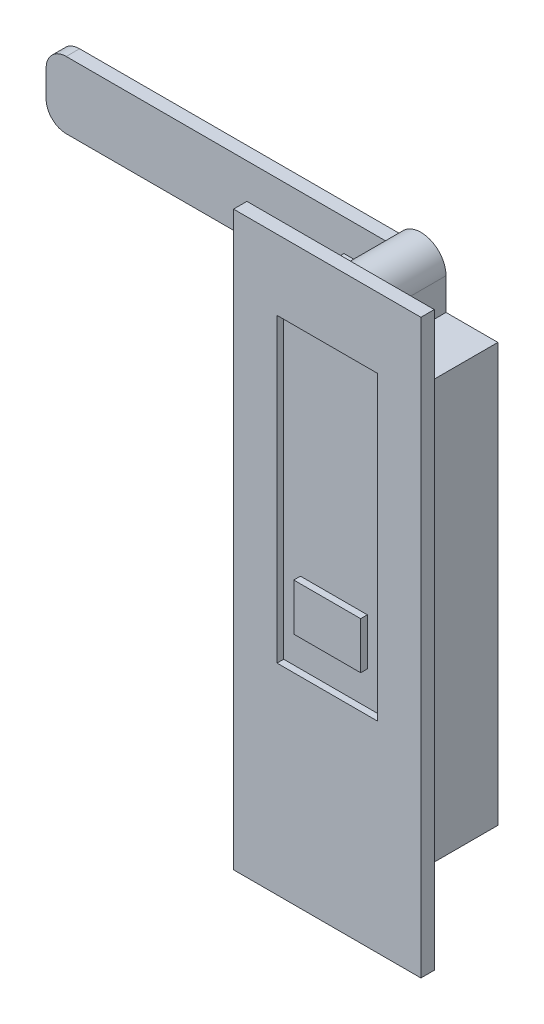
ISO-10303-21;
HEADER;
FILE_DESCRIPTION(('STEP AP214'),'2;1');
FILE_NAME('part.step','',(''),(''),'','','');
FILE_SCHEMA(('AUTOMOTIVE_DESIGN { 1 0 10303 214 1 1 1 1 }'));
ENDSEC;
DATA;
#1=APPLICATION_CONTEXT('core data for automotive mechanical design processes');
#2=APPLICATION_PROTOCOL_DEFINITION('international standard','automotive_design',2000,#1);
#3=PRODUCT_CONTEXT('',#1,'mechanical');
#4=PRODUCT('Part','Part','',(#3));
#5=PRODUCT_RELATED_PRODUCT_CATEGORY('part','',(#4));
#6=PRODUCT_DEFINITION_FORMATION('','',#4);
#7=PRODUCT_DEFINITION_CONTEXT('part definition',#1,'design');
#8=PRODUCT_DEFINITION('design','',#6,#7);
#9=PRODUCT_DEFINITION_SHAPE('','',#8);
#10=(LENGTH_UNIT() NAMED_UNIT(*) SI_UNIT(.MILLI.,.METRE.));
#11=(NAMED_UNIT(*) PLANE_ANGLE_UNIT() SI_UNIT($,.RADIAN.));
#12=(NAMED_UNIT(*) SI_UNIT($,.STERADIAN.) SOLID_ANGLE_UNIT());
#13=UNCERTAINTY_MEASURE_WITH_UNIT(LENGTH_MEASURE(1.E-05),#10,'distance_accuracy_value','');
#14=(GEOMETRIC_REPRESENTATION_CONTEXT(3) GLOBAL_UNCERTAINTY_ASSIGNED_CONTEXT((#13)) GLOBAL_UNIT_ASSIGNED_CONTEXT((#10,
#11,#12)) REPRESENTATION_CONTEXT('',''));
#15=CARTESIAN_POINT('',(0.,0.,0.));
#16=DIRECTION('',(0.,0.,1.));
#17=DIRECTION('',(1.,0.,0.));
#18=AXIS2_PLACEMENT_3D('',#15,#16,#17);
#19=CARTESIAN_POINT('',(14.,-42.75,2.));
#20=DIRECTION('',(-1.,0.,0.));
#21=DIRECTION('',(0.,0.,1.));
#22=AXIS2_PLACEMENT_3D('',#19,#20,#21);
#23=PLANE('',#22);
#24=DIRECTION('',(0.,1.,0.));
#25=VECTOR('',#24,1.);
#26=CARTESIAN_POINT('',(14.,-42.75,0.));
#27=LINE('',#26,#25);
#28=CARTESIAN_POINT('',(14.,-42.75,0.));
#29=VERTEX_POINT('',#28);
#30=CARTESIAN_POINT('',(14.,42.75,0.));
#31=VERTEX_POINT('',#30);
#32=EDGE_CURVE('E479',#29,#31,#27,.T.);
#33=ORIENTED_EDGE('',*,*,#32,.T.);
#34=DIRECTION('',(0.,0.,-1.));
#35=VECTOR('',#34,1.);
#36=CARTESIAN_POINT('',(14.,42.75,2.));
#37=LINE('',#36,#35);
#38=CARTESIAN_POINT('',(14.,42.75,2.));
#39=VERTEX_POINT('',#38);
#40=EDGE_CURVE('E46',#39,#31,#37,.T.);
#41=ORIENTED_EDGE('',*,*,#40,.F.);
#42=DIRECTION('',(0.,1.,0.));
#43=VECTOR('',#42,1.);
#44=CARTESIAN_POINT('',(14.,-42.75,2.));
#45=LINE('',#44,#43);
#46=CARTESIAN_POINT('',(14.,-42.75,2.));
#47=VERTEX_POINT('',#46);
#48=EDGE_CURVE('E489',#47,#39,#45,.T.);
#49=ORIENTED_EDGE('',*,*,#48,.F.);
#50=DIRECTION('',(0.,0.,-1.));
#51=VECTOR('',#50,1.);
#52=CARTESIAN_POINT('',(14.,-42.75,2.));
#53=LINE('',#52,#51);
#54=EDGE_CURVE('E503',#47,#29,#53,.T.);
#55=ORIENTED_EDGE('',*,*,#54,.T.);
#56=EDGE_LOOP('',(#33,#41,#49,#55));
#57=FACE_BOUND('',#56,.T.);
#58=ADVANCED_FACE('F43',(#57),#23,.F.);
#59=CARTESIAN_POINT('',(-14.,42.75,2.));
#60=DIRECTION('',(0.,-1.,0.));
#61=DIRECTION('',(0.,0.,-1.));
#62=AXIS2_PLACEMENT_3D('',#59,#60,#61);
#63=PLANE('',#62);
#64=DIRECTION('',(-1.,0.,0.));
#65=VECTOR('',#64,1.);
#66=CARTESIAN_POINT('',(-14.,42.75,0.));
#67=LINE('',#66,#65);
#68=CARTESIAN_POINT('',(-14.,42.75,0.));
#69=VERTEX_POINT('',#68);
#70=EDGE_CURVE('E507',#31,#69,#67,.T.);
#71=ORIENTED_EDGE('',*,*,#70,.T.);
#72=DIRECTION('',(0.,0.,-1.));
#73=VECTOR('',#72,1.);
#74=CARTESIAN_POINT('',(-14.,42.75,2.));
#75=LINE('',#74,#73);
#76=CARTESIAN_POINT('',(-14.,42.75,2.));
#77=VERTEX_POINT('',#76);
#78=EDGE_CURVE('E521',#77,#69,#75,.T.);
#79=ORIENTED_EDGE('',*,*,#78,.F.);
#80=DIRECTION('',(-1.,0.,0.));
#81=VECTOR('',#80,1.);
#82=CARTESIAN_POINT('',(-14.,42.75,2.));
#83=LINE('',#82,#81);
#84=EDGE_CURVE('E493',#39,#77,#83,.T.);
#85=ORIENTED_EDGE('',*,*,#84,.F.);
#86=ORIENTED_EDGE('',*,*,#40,.T.);
#87=EDGE_LOOP('',(#71,#79,#85,#86));
#88=FACE_BOUND('',#87,.T.);
#89=ADVANCED_FACE('F532',(#88),#63,.F.);
#90=CARTESIAN_POINT('',(-14.,-42.75,2.));
#91=DIRECTION('',(1.,0.,0.));
#92=DIRECTION('',(0.,0.,-1.));
#93=AXIS2_PLACEMENT_3D('',#90,#91,#92);
#94=PLANE('',#93);
#95=DIRECTION('',(0.,-1.,0.));
#96=VECTOR('',#95,1.);
#97=CARTESIAN_POINT('',(-14.,-42.75,0.));
#98=LINE('',#97,#96);
#99=CARTESIAN_POINT('',(-14.,-42.75,0.));
#100=VERTEX_POINT('',#99);
#101=EDGE_CURVE('E510',#69,#100,#98,.T.);
#102=ORIENTED_EDGE('',*,*,#101,.T.);
#103=DIRECTION('',(0.,0.,-1.));
#104=VECTOR('',#103,1.);
#105=CARTESIAN_POINT('',(-14.,-42.75,2.));
#106=LINE('',#105,#104);
#107=CARTESIAN_POINT('',(-14.,-42.75,2.));
#108=VERTEX_POINT('',#107);
#109=EDGE_CURVE('E518',#108,#100,#106,.T.);
#110=ORIENTED_EDGE('',*,*,#109,.F.);
#111=DIRECTION('',(0.,-1.,0.));
#112=VECTOR('',#111,1.);
#113=CARTESIAN_POINT('',(-14.,-42.75,2.));
#114=LINE('',#113,#112);
#115=EDGE_CURVE('E497',#77,#108,#114,.T.);
#116=ORIENTED_EDGE('',*,*,#115,.F.);
#117=ORIENTED_EDGE('',*,*,#78,.T.);
#118=EDGE_LOOP('',(#102,#110,#116,#117));
#119=FACE_BOUND('',#118,.T.);
#120=ADVANCED_FACE('F541',(#119),#94,.F.);
#121=CARTESIAN_POINT('',(-14.,-42.75,2.));
#122=DIRECTION('',(0.,1.,0.));
#123=DIRECTION('',(0.,0.,1.));
#124=AXIS2_PLACEMENT_3D('',#121,#122,#123);
#125=PLANE('',#124);
#126=DIRECTION('',(1.,0.,0.));
#127=VECTOR('',#126,1.);
#128=CARTESIAN_POINT('',(-14.,-42.75,0.));
#129=LINE('',#128,#127);
#130=EDGE_CURVE('E494',#100,#29,#129,.T.);
#131=ORIENTED_EDGE('',*,*,#130,.T.);
#132=ORIENTED_EDGE('',*,*,#54,.F.);
#133=DIRECTION('',(1.,0.,0.));
#134=VECTOR('',#133,1.);
#135=CARTESIAN_POINT('',(-14.,-42.75,2.));
#136=LINE('',#135,#134);
#137=EDGE_CURVE('E500',#108,#47,#136,.T.);
#138=ORIENTED_EDGE('',*,*,#137,.F.);
#139=ORIENTED_EDGE('',*,*,#109,.T.);
#140=EDGE_LOOP('',(#131,#132,#138,#139));
#141=FACE_BOUND('',#140,.T.);
#142=ADVANCED_FACE('F544',(#141),#125,.F.);
#143=CARTESIAN_POINT('',(0.,0.,2.));
#144=DIRECTION('',(0.,0.,-1.));
#145=DIRECTION('',(-1.,0.,0.));
#146=AXIS2_PLACEMENT_3D('',#143,#144,#145);
#147=PLANE('',#146);
#148=DIRECTION('',(-1.,0.,0.));
#149=VECTOR('',#148,1.);
#150=CARTESIAN_POINT('',(-7.5,32.25,2.));
#151=LINE('',#150,#149);
#152=CARTESIAN_POINT('',(7.5,32.25,2.));
#153=VERTEX_POINT('',#152);
#154=CARTESIAN_POINT('',(-7.5,32.25,2.));
#155=VERTEX_POINT('',#154);
#156=EDGE_CURVE('E465',#153,#155,#151,.T.);
#157=ORIENTED_EDGE('',*,*,#156,.F.);
#158=DIRECTION('',(0.,1.,0.));
#159=VECTOR('',#158,1.);
#160=CARTESIAN_POINT('',(7.5,-12.75,2.));
#161=LINE('',#160,#159);
#162=CARTESIAN_POINT('',(7.5,-12.75,2.));
#163=VERTEX_POINT('',#162);
#164=EDGE_CURVE('E435',#163,#153,#161,.T.);
#165=ORIENTED_EDGE('',*,*,#164,.F.);
#166=DIRECTION('',(1.,0.,0.));
#167=VECTOR('',#166,1.);
#168=CARTESIAN_POINT('',(-7.5,-12.75,2.));
#169=LINE('',#168,#167);
#170=CARTESIAN_POINT('',(-7.5,-12.75,2.));
#171=VERTEX_POINT('',#170);
#172=EDGE_CURVE('E450',#171,#163,#169,.T.);
#173=ORIENTED_EDGE('',*,*,#172,.F.);
#174=DIRECTION('',(0.,-1.,0.));
#175=VECTOR('',#174,1.);
#176=CARTESIAN_POINT('',(-7.5,-12.75,2.));
#177=LINE('',#176,#175);
#178=EDGE_CURVE('E469',#155,#171,#177,.T.);
#179=ORIENTED_EDGE('',*,*,#178,.F.);
#180=EDGE_LOOP('',(#157,#165,#173,#179));
#181=FACE_BOUND('',#180,.T.);
#182=ORIENTED_EDGE('',*,*,#48,.T.);
#183=ORIENTED_EDGE('',*,*,#84,.T.);
#184=ORIENTED_EDGE('',*,*,#115,.T.);
#185=ORIENTED_EDGE('',*,*,#137,.T.);
#186=EDGE_LOOP('',(#182,#183,#184,#185));
#187=FACE_BOUND('',#186,.T.);
#188=ADVANCED_FACE('F546',(#181,#187),#147,.F.);
#189=CARTESIAN_POINT('',(0.,0.,0.));
#190=DIRECTION('',(0.,0.,-1.));
#191=DIRECTION('',(-1.,0.,0.));
#192=AXIS2_PLACEMENT_3D('',#189,#190,#191);
#193=PLANE('',#192);
#194=DIRECTION('',(-1.,0.,0.));
#195=VECTOR('',#194,1.);
#196=CARTESIAN_POINT('',(0.,-31.25,0.));
#197=LINE('',#196,#195);
#198=CARTESIAN_POINT('',(11.5,-31.25,0.));
#199=VERTEX_POINT('',#198);
#200=CARTESIAN_POINT('',(3.75,-31.25,0.));
#201=VERTEX_POINT('',#200);
#202=EDGE_CURVE('E266',#199,#201,#197,.T.);
#203=ORIENTED_EDGE('',*,*,#202,.F.);
#204=DIRECTION('',(0.,1.,0.));
#205=VECTOR('',#204,1.);
#206=CARTESIAN_POINT('',(11.5,0.,0.));
#207=LINE('',#206,#205);
#208=CARTESIAN_POINT('',(11.5,31.25,0.));
#209=VERTEX_POINT('',#208);
#210=EDGE_CURVE('E280',#199,#209,#207,.T.);
#211=ORIENTED_EDGE('',*,*,#210,.T.);
#212=DIRECTION('',(-1.,0.,0.));
#213=VECTOR('',#212,1.);
#214=CARTESIAN_POINT('',(0.,31.25,0.));
#215=LINE('',#214,#213);
#216=CARTESIAN_POINT('',(3.75,31.25,0.));
#217=VERTEX_POINT('',#216);
#218=EDGE_CURVE('E352',#209,#217,#215,.T.);
#219=ORIENTED_EDGE('',*,*,#218,.T.);
#220=DIRECTION('',(0.,1.,0.));
#221=VECTOR('',#220,1.);
#222=CARTESIAN_POINT('',(3.75,0.,0.));
#223=LINE('',#222,#221);
#224=CARTESIAN_POINT('',(3.75,36.,0.));
#225=VERTEX_POINT('',#224);
#226=EDGE_CURVE('E348',#217,#225,#223,.T.);
#227=ORIENTED_EDGE('',*,*,#226,.T.);
#228=CARTESIAN_POINT('',(0.,36.,0.));
#229=DIRECTION('',(0.,0.,-1.));
#230=DIRECTION('',(-1.,0.,0.));
#231=AXIS2_PLACEMENT_3D('',#228,#229,#230);
#232=CIRCLE('',#231,3.75);
#233=CARTESIAN_POINT('',(-3.75,36.,0.));
#234=VERTEX_POINT('',#233);
#235=EDGE_CURVE('E344',#234,#225,#232,.T.);
#236=ORIENTED_EDGE('',*,*,#235,.F.);
#237=DIRECTION('',(0.,1.,0.));
#238=VECTOR('',#237,1.);
#239=CARTESIAN_POINT('',(-3.75,0.,0.));
#240=LINE('',#239,#238);
#241=CARTESIAN_POINT('',(-3.75,31.25,0.));
#242=VERTEX_POINT('',#241);
#243=EDGE_CURVE('E341',#242,#234,#240,.T.);
#244=ORIENTED_EDGE('',*,*,#243,.F.);
#245=DIRECTION('',(-1.,0.,0.));
#246=VECTOR('',#245,1.);
#247=CARTESIAN_POINT('',(0.,31.25,0.));
#248=LINE('',#247,#246);
#249=CARTESIAN_POINT('',(-11.5,31.25,0.));
#250=VERTEX_POINT('',#249);
#251=EDGE_CURVE('E337',#242,#250,#248,.T.);
#252=ORIENTED_EDGE('',*,*,#251,.T.);
#253=DIRECTION('',(0.,1.,0.));
#254=VECTOR('',#253,1.);
#255=CARTESIAN_POINT('',(-11.5,0.,0.));
#256=LINE('',#255,#254);
#257=CARTESIAN_POINT('',(-11.5,-31.25,0.));
#258=VERTEX_POINT('',#257);
#259=EDGE_CURVE('E333',#258,#250,#256,.T.);
#260=ORIENTED_EDGE('',*,*,#259,.F.);
#261=DIRECTION('',(-1.,0.,0.));
#262=VECTOR('',#261,1.);
#263=CARTESIAN_POINT('',(0.,-31.25,0.));
#264=LINE('',#263,#262);
#265=CARTESIAN_POINT('',(-3.75,-31.25,0.));
#266=VERTEX_POINT('',#265);
#267=EDGE_CURVE('E330',#266,#258,#264,.T.);
#268=ORIENTED_EDGE('',*,*,#267,.F.);
#269=DIRECTION('',(0.,1.,0.));
#270=VECTOR('',#269,1.);
#271=CARTESIAN_POINT('',(-3.75,0.,0.));
#272=LINE('',#271,#270);
#273=CARTESIAN_POINT('',(-3.74999999999999,-36.,0.));
#274=VERTEX_POINT('',#273);
#275=EDGE_CURVE('E327',#274,#266,#272,.T.);
#276=ORIENTED_EDGE('',*,*,#275,.F.);
#277=CARTESIAN_POINT('',(0.,-36.,0.));
#278=DIRECTION('',(0.,0.,-1.));
#279=DIRECTION('',(-1.,0.,0.));
#280=AXIS2_PLACEMENT_3D('',#277,#278,#279);
#281=CIRCLE('',#280,3.75);
#282=CARTESIAN_POINT('',(3.75000000000001,-36.,0.));
#283=VERTEX_POINT('',#282);
#284=EDGE_CURVE('E324',#283,#274,#281,.T.);
#285=ORIENTED_EDGE('',*,*,#284,.F.);
#286=DIRECTION('',(0.,1.,0.));
#287=VECTOR('',#286,1.);
#288=CARTESIAN_POINT('',(3.75,0.,0.));
#289=LINE('',#288,#287);
#290=EDGE_CURVE('E270',#283,#201,#289,.T.);
#291=ORIENTED_EDGE('',*,*,#290,.T.);
#292=EDGE_LOOP('',(#203,#211,#219,#227,#236,#244,#252,#260,#268,#276,#285,#291));
#293=FACE_BOUND('',#292,.T.);
#294=ORIENTED_EDGE('',*,*,#32,.F.);
#295=ORIENTED_EDGE('',*,*,#130,.F.);
#296=ORIENTED_EDGE('',*,*,#101,.F.);
#297=ORIENTED_EDGE('',*,*,#70,.F.);
#298=EDGE_LOOP('',(#294,#295,#296,#297));
#299=FACE_BOUND('',#298,.T.);
#300=ADVANCED_FACE('F539',(#293,#299),#193,.T.);
#301=CARTESIAN_POINT('',(7.5,-12.75,1.));
#302=DIRECTION('',(1.,0.,0.));
#303=DIRECTION('',(0.,0.,-1.));
#304=AXIS2_PLACEMENT_3D('',#301,#302,#303);
#305=PLANE('',#304);
#306=ORIENTED_EDGE('',*,*,#164,.T.);
#307=DIRECTION('',(0.,0.,1.));
#308=VECTOR('',#307,1.);
#309=CARTESIAN_POINT('',(7.5,32.25,1.));
#310=LINE('',#309,#308);
#311=CARTESIAN_POINT('',(7.5,32.25,1.));
#312=VERTEX_POINT('',#311);
#313=EDGE_CURVE('E462',#312,#153,#310,.T.);
#314=ORIENTED_EDGE('',*,*,#313,.F.);
#315=DIRECTION('',(0.,1.,0.));
#316=VECTOR('',#315,1.);
#317=CARTESIAN_POINT('',(7.5,-12.75,1.));
#318=LINE('',#317,#316);
#319=CARTESIAN_POINT('',(7.5,-12.75,1.));
#320=VERTEX_POINT('',#319);
#321=EDGE_CURVE('E445',#320,#312,#318,.T.);
#322=ORIENTED_EDGE('',*,*,#321,.F.);
#323=DIRECTION('',(0.,0.,1.));
#324=VECTOR('',#323,1.);
#325=CARTESIAN_POINT('',(7.5,-12.75,1.));
#326=LINE('',#325,#324);
#327=EDGE_CURVE('E476',#320,#163,#326,.T.);
#328=ORIENTED_EDGE('',*,*,#327,.T.);
#329=EDGE_LOOP('',(#306,#314,#322,#328));
#330=FACE_BOUND('',#329,.T.);
#331=ADVANCED_FACE('F555',(#330),#305,.F.);
#332=CARTESIAN_POINT('',(-7.5,-12.75,1.));
#333=DIRECTION('',(0.,-1.,0.));
#334=DIRECTION('',(0.,0.,-1.));
#335=AXIS2_PLACEMENT_3D('',#332,#333,#334);
#336=PLANE('',#335);
#337=ORIENTED_EDGE('',*,*,#172,.T.);
#338=ORIENTED_EDGE('',*,*,#327,.F.);
#339=DIRECTION('',(1.,0.,0.));
#340=VECTOR('',#339,1.);
#341=CARTESIAN_POINT('',(-7.5,-12.75,1.));
#342=LINE('',#341,#340);
#343=CARTESIAN_POINT('',(-7.5,-12.75,1.));
#344=VERTEX_POINT('',#343);
#345=EDGE_CURVE('E458',#344,#320,#342,.T.);
#346=ORIENTED_EDGE('',*,*,#345,.F.);
#347=DIRECTION('',(0.,0.,1.));
#348=VECTOR('',#347,1.);
#349=CARTESIAN_POINT('',(-7.5,-12.75,1.));
#350=LINE('',#349,#348);
#351=EDGE_CURVE('E480',#344,#171,#350,.T.);
#352=ORIENTED_EDGE('',*,*,#351,.T.);
#353=EDGE_LOOP('',(#337,#338,#346,#352));
#354=FACE_BOUND('',#353,.T.);
#355=ADVANCED_FACE('F593',(#354),#336,.F.);
#356=CARTESIAN_POINT('',(-7.5,-12.75,1.));
#357=DIRECTION('',(-1.,0.,0.));
#358=DIRECTION('',(0.,0.,1.));
#359=AXIS2_PLACEMENT_3D('',#356,#357,#358);
#360=PLANE('',#359);
#361=ORIENTED_EDGE('',*,*,#178,.T.);
#362=ORIENTED_EDGE('',*,*,#351,.F.);
#363=DIRECTION('',(0.,-1.,0.));
#364=VECTOR('',#363,1.);
#365=CARTESIAN_POINT('',(-7.5,-12.75,1.));
#366=LINE('',#365,#364);
#367=CARTESIAN_POINT('',(-7.5,32.25,1.));
#368=VERTEX_POINT('',#367);
#369=EDGE_CURVE('E454',#368,#344,#366,.T.);
#370=ORIENTED_EDGE('',*,*,#369,.F.);
#371=DIRECTION('',(0.,0.,1.));
#372=VECTOR('',#371,1.);
#373=CARTESIAN_POINT('',(-7.5,32.25,1.));
#374=LINE('',#373,#372);
#375=EDGE_CURVE('E483',#368,#155,#374,.T.);
#376=ORIENTED_EDGE('',*,*,#375,.T.);
#377=EDGE_LOOP('',(#361,#362,#370,#376));
#378=FACE_BOUND('',#377,.T.);
#379=ADVANCED_FACE('F603',(#378),#360,.F.);
#380=CARTESIAN_POINT('',(-7.5,32.25,1.));
#381=DIRECTION('',(0.,1.,0.));
#382=DIRECTION('',(0.,0.,1.));
#383=AXIS2_PLACEMENT_3D('',#380,#381,#382);
#384=PLANE('',#383);
#385=ORIENTED_EDGE('',*,*,#156,.T.);
#386=ORIENTED_EDGE('',*,*,#375,.F.);
#387=DIRECTION('',(-1.,0.,0.));
#388=VECTOR('',#387,1.);
#389=CARTESIAN_POINT('',(-7.5,32.25,1.));
#390=LINE('',#389,#388);
#391=EDGE_CURVE('E449',#312,#368,#390,.T.);
#392=ORIENTED_EDGE('',*,*,#391,.F.);
#393=ORIENTED_EDGE('',*,*,#313,.T.);
#394=EDGE_LOOP('',(#385,#386,#392,#393));
#395=FACE_BOUND('',#394,.T.);
#396=ADVANCED_FACE('F613',(#395),#384,.F.);
#397=CARTESIAN_POINT('',(0.,0.,1.));
#398=DIRECTION('',(0.,0.,-1.));
#399=DIRECTION('',(-1.,0.,0.));
#400=AXIS2_PLACEMENT_3D('',#397,#398,#399);
#401=PLANE('',#400);
#402=DIRECTION('',(0.,1.,0.));
#403=VECTOR('',#402,1.);
#404=CARTESIAN_POINT('',(5.00000000000002,-7.75,1.));
#405=LINE('',#404,#403);
#406=CARTESIAN_POINT('',(5.00000000000002,-7.75,1.));
#407=VERTEX_POINT('',#406);
#408=CARTESIAN_POINT('',(5.00000000000002,-0.750000000000004,1.));
#409=VERTEX_POINT('',#408);
#410=EDGE_CURVE('E400',#407,#409,#405,.T.);
#411=ORIENTED_EDGE('',*,*,#410,.F.);
#412=DIRECTION('',(1.,0.,0.));
#413=VECTOR('',#412,1.);
#414=CARTESIAN_POINT('',(-4.99999999999998,-7.75,1.));
#415=LINE('',#414,#413);
#416=CARTESIAN_POINT('',(-4.99999999999998,-7.75,1.));
#417=VERTEX_POINT('',#416);
#418=EDGE_CURVE('E413',#417,#407,#415,.T.);
#419=ORIENTED_EDGE('',*,*,#418,.F.);
#420=DIRECTION('',(0.,-1.,0.));
#421=VECTOR('',#420,1.);
#422=CARTESIAN_POINT('',(-4.99999999999998,-7.75,1.));
#423=LINE('',#422,#421);
#424=CARTESIAN_POINT('',(-4.99999999999998,-0.750000000000004,1.));
#425=VERTEX_POINT('',#424);
#426=EDGE_CURVE('E409',#425,#417,#423,.T.);
#427=ORIENTED_EDGE('',*,*,#426,.F.);
#428=DIRECTION('',(-1.,0.,0.));
#429=VECTOR('',#428,1.);
#430=CARTESIAN_POINT('',(-4.99999999999998,-0.750000000000004,1.));
#431=LINE('',#430,#429);
#432=EDGE_CURVE('E404',#409,#425,#431,.T.);
#433=ORIENTED_EDGE('',*,*,#432,.F.);
#434=EDGE_LOOP('',(#411,#419,#427,#433));
#435=FACE_BOUND('',#434,.T.);
#436=ORIENTED_EDGE('',*,*,#321,.T.);
#437=ORIENTED_EDGE('',*,*,#391,.T.);
#438=ORIENTED_EDGE('',*,*,#369,.T.);
#439=ORIENTED_EDGE('',*,*,#345,.T.);
#440=EDGE_LOOP('',(#436,#437,#438,#439));
#441=FACE_BOUND('',#440,.T.);
#442=ADVANCED_FACE('F623',(#435,#441),#401,.F.);
#443=CARTESIAN_POINT('',(5.00000000000002,-7.75,1.));
#444=DIRECTION('',(1.,0.,0.));
#445=DIRECTION('',(0.,1.,0.));
#446=AXIS2_PLACEMENT_3D('',#443,#444,#445);
#447=PLANE('',#446);
#448=DIRECTION('',(0.,1.,0.));
#449=VECTOR('',#448,1.);
#450=CARTESIAN_POINT('',(5.00000000000002,-7.75,2.));
#451=LINE('',#450,#449);
#452=CARTESIAN_POINT('',(5.00000000000002,-7.75,2.));
#453=VERTEX_POINT('',#452);
#454=CARTESIAN_POINT('',(5.00000000000002,-0.750000000000004,2.));
#455=VERTEX_POINT('',#454);
#456=EDGE_CURVE('E399',#453,#455,#451,.T.);
#457=ORIENTED_EDGE('',*,*,#456,.F.);
#458=DIRECTION('',(0.,0.,1.));
#459=VECTOR('',#458,1.);
#460=CARTESIAN_POINT('',(5.00000000000002,-7.75,1.));
#461=LINE('',#460,#459);
#462=EDGE_CURVE('E432',#407,#453,#461,.T.);
#463=ORIENTED_EDGE('',*,*,#462,.F.);
#464=ORIENTED_EDGE('',*,*,#410,.T.);
#465=DIRECTION('',(0.,0.,1.));
#466=VECTOR('',#465,1.);
#467=CARTESIAN_POINT('',(5.00000000000002,-0.750000000000004,1.));
#468=LINE('',#467,#466);
#469=EDGE_CURVE('E417',#409,#455,#468,.T.);
#470=ORIENTED_EDGE('',*,*,#469,.T.);
#471=EDGE_LOOP('',(#457,#463,#464,#470));
#472=FACE_BOUND('',#471,.T.);
#473=ADVANCED_FACE('F633',(#472),#447,.T.);
#474=CARTESIAN_POINT('',(-4.99999999999998,-7.75,1.));
#475=DIRECTION('',(0.,-1.,0.));
#476=DIRECTION('',(0.,0.,-1.));
#477=AXIS2_PLACEMENT_3D('',#474,#475,#476);
#478=PLANE('',#477);
#479=DIRECTION('',(1.,0.,0.));
#480=VECTOR('',#479,1.);
#481=CARTESIAN_POINT('',(-4.99999999999998,-7.75,2.));
#482=LINE('',#481,#480);
#483=CARTESIAN_POINT('',(-4.99999999999998,-7.75,2.));
#484=VERTEX_POINT('',#483);
#485=EDGE_CURVE('E405',#484,#453,#482,.T.);
#486=ORIENTED_EDGE('',*,*,#485,.F.);
#487=DIRECTION('',(0.,0.,1.));
#488=VECTOR('',#487,1.);
#489=CARTESIAN_POINT('',(-4.99999999999998,-7.75,1.));
#490=LINE('',#489,#488);
#491=EDGE_CURVE('E436',#417,#484,#490,.T.);
#492=ORIENTED_EDGE('',*,*,#491,.F.);
#493=ORIENTED_EDGE('',*,*,#418,.T.);
#494=ORIENTED_EDGE('',*,*,#462,.T.);
#495=EDGE_LOOP('',(#486,#492,#493,#494));
#496=FACE_BOUND('',#495,.T.);
#497=ADVANCED_FACE('F643',(#496),#478,.T.);
#498=CARTESIAN_POINT('',(-4.99999999999998,-7.75,1.));
#499=DIRECTION('',(-1.,0.,0.));
#500=DIRECTION('',(0.,0.,1.));
#501=AXIS2_PLACEMENT_3D('',#498,#499,#500);
#502=PLANE('',#501);
#503=DIRECTION('',(0.,-1.,0.));
#504=VECTOR('',#503,1.);
#505=CARTESIAN_POINT('',(-4.99999999999998,-7.75,2.));
#506=LINE('',#505,#504);
#507=CARTESIAN_POINT('',(-4.99999999999998,-0.750000000000004,2.));
#508=VERTEX_POINT('',#507);
#509=EDGE_CURVE('E425',#508,#484,#506,.T.);
#510=ORIENTED_EDGE('',*,*,#509,.F.);
#511=DIRECTION('',(0.,0.,1.));
#512=VECTOR('',#511,1.);
#513=CARTESIAN_POINT('',(-4.99999999999998,-0.750000000000004,1.));
#514=LINE('',#513,#512);
#515=EDGE_CURVE('E439',#425,#508,#514,.T.);
#516=ORIENTED_EDGE('',*,*,#515,.F.);
#517=ORIENTED_EDGE('',*,*,#426,.T.);
#518=ORIENTED_EDGE('',*,*,#491,.T.);
#519=EDGE_LOOP('',(#510,#516,#517,#518));
#520=FACE_BOUND('',#519,.T.);
#521=ADVANCED_FACE('F653',(#520),#502,.T.);
#522=CARTESIAN_POINT('',(-4.99999999999998,-0.750000000000004,1.));
#523=DIRECTION('',(0.,1.,0.));
#524=DIRECTION('',(0.,0.,1.));
#525=AXIS2_PLACEMENT_3D('',#522,#523,#524);
#526=PLANE('',#525);
#527=DIRECTION('',(-1.,0.,0.));
#528=VECTOR('',#527,1.);
#529=CARTESIAN_POINT('',(-4.99999999999998,-0.750000000000004,2.));
#530=LINE('',#529,#528);
#531=EDGE_CURVE('E421',#455,#508,#530,.T.);
#532=ORIENTED_EDGE('',*,*,#531,.F.);
#533=ORIENTED_EDGE('',*,*,#469,.F.);
#534=ORIENTED_EDGE('',*,*,#432,.T.);
#535=ORIENTED_EDGE('',*,*,#515,.T.);
#536=EDGE_LOOP('',(#532,#533,#534,#535));
#537=FACE_BOUND('',#536,.T.);
#538=ADVANCED_FACE('F563',(#537),#526,.T.);
#539=ORIENTED_EDGE('',*,*,#456,.T.);
#540=ORIENTED_EDGE('',*,*,#531,.T.);
#541=ORIENTED_EDGE('',*,*,#509,.T.);
#542=ORIENTED_EDGE('',*,*,#485,.T.);
#543=EDGE_LOOP('',(#539,#540,#541,#542));
#544=FACE_BOUND('',#543,.T.);
#545=ADVANCED_FACE('F550',(#544),#147,.F.);
#546=CARTESIAN_POINT('',(0.,-31.25,-12.));
#547=DIRECTION('',(0.,1.,0.));
#548=DIRECTION('',(0.,0.,1.));
#549=AXIS2_PLACEMENT_3D('',#546,#547,#548);
#550=PLANE('',#549);
#551=ORIENTED_EDGE('',*,*,#202,.T.);
#552=DIRECTION('',(0.,0.,1.));
#553=VECTOR('',#552,1.);
#554=CARTESIAN_POINT('',(3.75,-31.25,-12.));
#555=LINE('',#554,#553);
#556=CARTESIAN_POINT('',(3.75,-31.25,-12.));
#557=VERTEX_POINT('',#556);
#558=EDGE_CURVE('E395',#557,#201,#555,.T.);
#559=ORIENTED_EDGE('',*,*,#558,.F.);
#560=DIRECTION('',(-1.,0.,0.));
#561=VECTOR('',#560,1.);
#562=CARTESIAN_POINT('',(0.,-31.25,-12.));
#563=LINE('',#562,#561);
#564=CARTESIAN_POINT('',(11.5,-31.25,-12.));
#565=VERTEX_POINT('',#564);
#566=EDGE_CURVE('E276',#565,#557,#563,.T.);
#567=ORIENTED_EDGE('',*,*,#566,.F.);
#568=DIRECTION('',(0.,0.,1.));
#569=VECTOR('',#568,1.);
#570=CARTESIAN_POINT('',(11.5,-31.25,-12.));
#571=LINE('',#570,#569);
#572=EDGE_CURVE('E319',#565,#199,#571,.T.);
#573=ORIENTED_EDGE('',*,*,#572,.T.);
#574=EDGE_LOOP('',(#551,#559,#567,#573));
#575=FACE_BOUND('',#574,.T.);
#576=ADVANCED_FACE('F562',(#575),#550,.F.);
#577=CARTESIAN_POINT('',(3.75,0.,-12.));
#578=DIRECTION('',(1.,0.,0.));
#579=DIRECTION('',(0.,1.,0.));
#580=AXIS2_PLACEMENT_3D('',#577,#578,#579);
#581=PLANE('',#580);
#582=ORIENTED_EDGE('',*,*,#290,.F.);
#583=DIRECTION('',(0.,0.,1.));
#584=VECTOR('',#583,1.);
#585=CARTESIAN_POINT('',(3.75000000000001,-36.,-12.));
#586=LINE('',#585,#584);
#587=CARTESIAN_POINT('',(3.75000000000001,-36.,-12.));
#588=VERTEX_POINT('',#587);
#589=EDGE_CURVE('E392',#588,#283,#586,.T.);
#590=ORIENTED_EDGE('',*,*,#589,.F.);
#591=DIRECTION('',(0.,1.,0.));
#592=VECTOR('',#591,1.);
#593=CARTESIAN_POINT('',(3.75,0.,-12.));
#594=LINE('',#593,#592);
#595=EDGE_CURVE('E279',#588,#557,#594,.T.);
#596=ORIENTED_EDGE('',*,*,#595,.T.);
#597=ORIENTED_EDGE('',*,*,#558,.T.);
#598=EDGE_LOOP('',(#582,#590,#596,#597));
#599=FACE_BOUND('',#598,.T.);
#600=ADVANCED_FACE('F692',(#599),#581,.T.);
#601=CARTESIAN_POINT('',(0.,-36.,-12.));
#602=DIRECTION('',(0.,0.,1.));
#603=DIRECTION('',(1.,0.,0.));
#604=AXIS2_PLACEMENT_3D('',#601,#602,#603);
#605=CYLINDRICAL_SURFACE('',#604,3.75);
#606=ORIENTED_EDGE('',*,*,#284,.T.);
#607=DIRECTION('',(0.,0.,1.));
#608=VECTOR('',#607,1.);
#609=CARTESIAN_POINT('',(-3.74999999999999,-36.,-12.));
#610=LINE('',#609,#608);
#611=CARTESIAN_POINT('',(-3.74999999999999,-36.,-12.));
#612=VERTEX_POINT('',#611);
#613=EDGE_CURVE('E388',#612,#274,#610,.T.);
#614=ORIENTED_EDGE('',*,*,#613,.F.);
#615=CARTESIAN_POINT('',(0.,-36.,-12.));
#616=DIRECTION('',(0.,0.,-1.));
#617=DIRECTION('',(-1.,0.,0.));
#618=AXIS2_PLACEMENT_3D('',#615,#616,#617);
#619=CIRCLE('',#618,3.75);
#620=EDGE_CURVE('E284',#588,#612,#619,.T.);
#621=ORIENTED_EDGE('',*,*,#620,.F.);
#622=ORIENTED_EDGE('',*,*,#589,.T.);
#623=EDGE_LOOP('',(#606,#614,#621,#622));
#624=FACE_BOUND('',#623,.T.);
#625=ADVANCED_FACE('F702',(#624),#605,.T.);
#626=CARTESIAN_POINT('',(-3.75,0.,-12.));
#627=DIRECTION('',(1.,0.,0.));
#628=DIRECTION('',(0.,1.,0.));
#629=AXIS2_PLACEMENT_3D('',#626,#627,#628);
#630=PLANE('',#629);
#631=ORIENTED_EDGE('',*,*,#275,.T.);
#632=DIRECTION('',(0.,0.,1.));
#633=VECTOR('',#632,1.);
#634=CARTESIAN_POINT('',(-3.75,-31.25,-12.));
#635=LINE('',#634,#633);
#636=CARTESIAN_POINT('',(-3.75,-31.25,-12.));
#637=VERTEX_POINT('',#636);
#638=EDGE_CURVE('E384',#637,#266,#635,.T.);
#639=ORIENTED_EDGE('',*,*,#638,.F.);
#640=DIRECTION('',(0.,1.,0.));
#641=VECTOR('',#640,1.);
#642=CARTESIAN_POINT('',(-3.75,0.,-12.));
#643=LINE('',#642,#641);
#644=EDGE_CURVE('E287',#612,#637,#643,.T.);
#645=ORIENTED_EDGE('',*,*,#644,.F.);
#646=ORIENTED_EDGE('',*,*,#613,.T.);
#647=EDGE_LOOP('',(#631,#639,#645,#646));
#648=FACE_BOUND('',#647,.T.);
#649=ADVANCED_FACE('F712',(#648),#630,.F.);
#650=CARTESIAN_POINT('',(0.,-31.25,-12.));
#651=DIRECTION('',(0.,1.,0.));
#652=DIRECTION('',(0.,0.,1.));
#653=AXIS2_PLACEMENT_3D('',#650,#651,#652);
#654=PLANE('',#653);
#655=ORIENTED_EDGE('',*,*,#267,.T.);
#656=DIRECTION('',(0.,0.,1.));
#657=VECTOR('',#656,1.);
#658=CARTESIAN_POINT('',(-11.5,-31.25,-12.));
#659=LINE('',#658,#657);
#660=CARTESIAN_POINT('',(-11.5,-31.25,-12.));
#661=VERTEX_POINT('',#660);
#662=EDGE_CURVE('E380',#661,#258,#659,.T.);
#663=ORIENTED_EDGE('',*,*,#662,.F.);
#664=DIRECTION('',(-1.,0.,0.));
#665=VECTOR('',#664,1.);
#666=CARTESIAN_POINT('',(0.,-31.25,-12.));
#667=LINE('',#666,#665);
#668=EDGE_CURVE('E290',#637,#661,#667,.T.);
#669=ORIENTED_EDGE('',*,*,#668,.F.);
#670=ORIENTED_EDGE('',*,*,#638,.T.);
#671=EDGE_LOOP('',(#655,#663,#669,#670));
#672=FACE_BOUND('',#671,.T.);
#673=ADVANCED_FACE('F722',(#672),#654,.F.);
#674=CARTESIAN_POINT('',(-11.5,0.,-12.));
#675=DIRECTION('',(1.,0.,0.));
#676=DIRECTION('',(0.,0.,-1.));
#677=AXIS2_PLACEMENT_3D('',#674,#675,#676);
#678=PLANE('',#677);
#679=ORIENTED_EDGE('',*,*,#259,.T.);
#680=DIRECTION('',(0.,0.,1.));
#681=VECTOR('',#680,1.);
#682=CARTESIAN_POINT('',(-11.5,31.25,-12.));
#683=LINE('',#682,#681);
#684=CARTESIAN_POINT('',(-11.5,31.25,-12.));
#685=VERTEX_POINT('',#684);
#686=EDGE_CURVE('E377',#685,#250,#683,.T.);
#687=ORIENTED_EDGE('',*,*,#686,.F.);
#688=DIRECTION('',(0.,1.,0.));
#689=VECTOR('',#688,1.);
#690=CARTESIAN_POINT('',(-11.5,0.,-12.));
#691=LINE('',#690,#689);
#692=CARTESIAN_POINT('',(-11.5,26.,-12.));
#693=VERTEX_POINT('',#692);
#694=EDGE_CURVE('E293',#693,#685,#691,.T.);
#695=ORIENTED_EDGE('',*,*,#694,.F.);
#696=EDGE_CURVE('E294',#661,#693,#691,.T.);
#697=ORIENTED_EDGE('',*,*,#696,.F.);
#698=ORIENTED_EDGE('',*,*,#662,.T.);
#699=EDGE_LOOP('',(#679,#687,#695,#697,#698));
#700=FACE_BOUND('',#699,.T.);
#701=ADVANCED_FACE('F732',(#700),#678,.F.);
#702=CARTESIAN_POINT('',(0.,31.25,-12.));
#703=DIRECTION('',(0.,1.,0.));
#704=DIRECTION('',(0.,0.,1.));
#705=AXIS2_PLACEMENT_3D('',#702,#703,#704);
#706=PLANE('',#705);
#707=ORIENTED_EDGE('',*,*,#251,.F.);
#708=DIRECTION('',(0.,0.,1.));
#709=VECTOR('',#708,1.);
#710=CARTESIAN_POINT('',(-3.75,31.25,-12.));
#711=LINE('',#710,#709);
#712=CARTESIAN_POINT('',(-3.75,31.25,-12.));
#713=VERTEX_POINT('',#712);
#714=EDGE_CURVE('E374',#713,#242,#711,.T.);
#715=ORIENTED_EDGE('',*,*,#714,.F.);
#716=DIRECTION('',(-1.,0.,0.));
#717=VECTOR('',#716,1.);
#718=CARTESIAN_POINT('',(0.,31.25,-12.));
#719=LINE('',#718,#717);
#720=EDGE_CURVE('E297',#713,#685,#719,.T.);
#721=ORIENTED_EDGE('',*,*,#720,.T.);
#722=ORIENTED_EDGE('',*,*,#686,.T.);
#723=EDGE_LOOP('',(#707,#715,#721,#722));
#724=FACE_BOUND('',#723,.T.);
#725=ADVANCED_FACE('F778',(#724),#706,.T.);
#726=CARTESIAN_POINT('',(-3.75,0.,-12.));
#727=DIRECTION('',(1.,0.,0.));
#728=DIRECTION('',(0.,1.,0.));
#729=AXIS2_PLACEMENT_3D('',#726,#727,#728);
#730=PLANE('',#729);
#731=ORIENTED_EDGE('',*,*,#243,.T.);
#732=DIRECTION('',(0.,0.,1.));
#733=VECTOR('',#732,1.);
#734=CARTESIAN_POINT('',(-3.75,36.,-12.));
#735=LINE('',#734,#733);
#736=CARTESIAN_POINT('',(-3.75,36.,-12.));
#737=VERTEX_POINT('',#736);
#738=EDGE_CURVE('E370',#737,#234,#735,.T.);
#739=ORIENTED_EDGE('',*,*,#738,.F.);
#740=DIRECTION('',(0.,1.,0.));
#741=VECTOR('',#740,1.);
#742=CARTESIAN_POINT('',(-3.75,0.,-12.));
#743=LINE('',#742,#741);
#744=EDGE_CURVE('E301',#713,#737,#743,.T.);
#745=ORIENTED_EDGE('',*,*,#744,.F.);
#746=ORIENTED_EDGE('',*,*,#714,.T.);
#747=EDGE_LOOP('',(#731,#739,#745,#746));
#748=FACE_BOUND('',#747,.T.);
#749=ADVANCED_FACE('F788',(#748),#730,.F.);
#750=CARTESIAN_POINT('',(0.,36.,-12.));
#751=DIRECTION('',(0.,0.,1.));
#752=DIRECTION('',(1.,0.,0.));
#753=AXIS2_PLACEMENT_3D('',#750,#751,#752);
#754=CYLINDRICAL_SURFACE('',#753,3.75);
#755=ORIENTED_EDGE('',*,*,#235,.T.);
#756=DIRECTION('',(0.,0.,1.));
#757=VECTOR('',#756,1.);
#758=CARTESIAN_POINT('',(3.75,36.,-12.));
#759=LINE('',#758,#757);
#760=CARTESIAN_POINT('',(3.75,36.,-12.));
#761=VERTEX_POINT('',#760);
#762=EDGE_CURVE('E367',#761,#225,#759,.T.);
#763=ORIENTED_EDGE('',*,*,#762,.F.);
#764=CARTESIAN_POINT('',(0.,36.,-12.));
#765=DIRECTION('',(0.,0.,-1.));
#766=DIRECTION('',(-1.,0.,0.));
#767=AXIS2_PLACEMENT_3D('',#764,#765,#766);
#768=CIRCLE('',#767,3.75);
#769=EDGE_CURVE('E305',#737,#761,#768,.T.);
#770=ORIENTED_EDGE('',*,*,#769,.F.);
#771=ORIENTED_EDGE('',*,*,#738,.T.);
#772=EDGE_LOOP('',(#755,#763,#770,#771));
#773=FACE_BOUND('',#772,.T.);
#774=ADVANCED_FACE('F746',(#773),#754,.T.);
#775=CARTESIAN_POINT('',(3.75,0.,-12.));
#776=DIRECTION('',(1.,0.,0.));
#777=DIRECTION('',(0.,1.,0.));
#778=AXIS2_PLACEMENT_3D('',#775,#776,#777);
#779=PLANE('',#778);
#780=ORIENTED_EDGE('',*,*,#226,.F.);
#781=DIRECTION('',(0.,0.,1.));
#782=VECTOR('',#781,1.);
#783=CARTESIAN_POINT('',(3.75,31.25,-12.));
#784=LINE('',#783,#782);
#785=CARTESIAN_POINT('',(3.75,31.25,-12.));
#786=VERTEX_POINT('',#785);
#787=EDGE_CURVE('E364',#786,#217,#784,.T.);
#788=ORIENTED_EDGE('',*,*,#787,.F.);
#789=DIRECTION('',(0.,1.,0.));
#790=VECTOR('',#789,1.);
#791=CARTESIAN_POINT('',(3.75,0.,-12.));
#792=LINE('',#791,#790);
#793=EDGE_CURVE('E308',#786,#761,#792,.T.);
#794=ORIENTED_EDGE('',*,*,#793,.T.);
#795=ORIENTED_EDGE('',*,*,#762,.T.);
#796=EDGE_LOOP('',(#780,#788,#794,#795));
#797=FACE_BOUND('',#796,.T.);
#798=ADVANCED_FACE('F740',(#797),#779,.T.);
#799=CARTESIAN_POINT('',(0.,31.25,-12.));
#800=DIRECTION('',(0.,1.,0.));
#801=DIRECTION('',(0.,0.,1.));
#802=AXIS2_PLACEMENT_3D('',#799,#800,#801);
#803=PLANE('',#802);
#804=ORIENTED_EDGE('',*,*,#218,.F.);
#805=DIRECTION('',(0.,0.,1.));
#806=VECTOR('',#805,1.);
#807=CARTESIAN_POINT('',(11.5,31.25,-12.));
#808=LINE('',#807,#806);
#809=CARTESIAN_POINT('',(11.5,31.25,-12.));
#810=VERTEX_POINT('',#809);
#811=EDGE_CURVE('E361',#810,#209,#808,.T.);
#812=ORIENTED_EDGE('',*,*,#811,.F.);
#813=DIRECTION('',(-1.,0.,0.));
#814=VECTOR('',#813,1.);
#815=CARTESIAN_POINT('',(0.,31.25,-12.));
#816=LINE('',#815,#814);
#817=EDGE_CURVE('E312',#810,#786,#816,.T.);
#818=ORIENTED_EDGE('',*,*,#817,.T.);
#819=ORIENTED_EDGE('',*,*,#787,.T.);
#820=EDGE_LOOP('',(#804,#812,#818,#819));
#821=FACE_BOUND('',#820,.T.);
#822=ADVANCED_FACE('F745',(#821),#803,.T.);
#823=CARTESIAN_POINT('',(11.5,0.,-12.));
#824=DIRECTION('',(1.,0.,0.));
#825=DIRECTION('',(0.,0.,-1.));
#826=AXIS2_PLACEMENT_3D('',#823,#824,#825);
#827=PLANE('',#826);
#828=ORIENTED_EDGE('',*,*,#210,.F.);
#829=ORIENTED_EDGE('',*,*,#572,.F.);
#830=DIRECTION('',(0.,1.,0.));
#831=VECTOR('',#830,1.);
#832=CARTESIAN_POINT('',(11.5,0.,-12.));
#833=LINE('',#832,#831);
#834=EDGE_CURVE('E316',#565,#810,#833,.T.);
#835=ORIENTED_EDGE('',*,*,#834,.T.);
#836=ORIENTED_EDGE('',*,*,#811,.T.);
#837=EDGE_LOOP('',(#828,#829,#835,#836));
#838=FACE_BOUND('',#837,.T.);
#839=ADVANCED_FACE('F758',(#838),#827,.T.);
#840=CARTESIAN_POINT('',(0.,0.,-12.));
#841=DIRECTION('',(0.,0.,-1.));
#842=DIRECTION('',(-1.,0.,0.));
#843=AXIS2_PLACEMENT_3D('',#840,#841,#842);
#844=PLANE('',#843);
#845=DIRECTION('',(1.,0.,0.));
#846=VECTOR('',#845,1.);
#847=CARTESIAN_POINT('',(0.,36.,-12.));
#848=LINE('',#847,#846);
#849=CARTESIAN_POINT('',(0.,36.,-12.));
#850=VERTEX_POINT('',#849);
#851=EDGE_CURVE('E11',#737,#850,#848,.T.);
#852=ORIENTED_EDGE('',*,*,#851,.F.);
#853=ORIENTED_EDGE('',*,*,#769,.T.);
#854=ORIENTED_EDGE('',*,*,#793,.F.);
#855=ORIENTED_EDGE('',*,*,#817,.F.);
#856=ORIENTED_EDGE('',*,*,#834,.F.);
#857=ORIENTED_EDGE('',*,*,#566,.T.);
#858=ORIENTED_EDGE('',*,*,#595,.F.);
#859=ORIENTED_EDGE('',*,*,#620,.T.);
#860=ORIENTED_EDGE('',*,*,#644,.T.);
#861=ORIENTED_EDGE('',*,*,#668,.T.);
#862=ORIENTED_EDGE('',*,*,#696,.T.);
#863=DIRECTION('',(-1.,0.,0.));
#864=VECTOR('',#863,1.);
#865=CARTESIAN_POINT('',(-53.,26.,-12.));
#866=LINE('',#865,#864);
#867=CARTESIAN_POINT('',(0.,26.,-12.));
#868=VERTEX_POINT('',#867);
#869=EDGE_CURVE('E64',#868,#693,#866,.T.);
#870=ORIENTED_EDGE('',*,*,#869,.F.);
#871=DIRECTION('',(0.,-1.,0.));
#872=VECTOR('',#871,1.);
#873=CARTESIAN_POINT('',(0.,26.,-12.));
#874=LINE('',#873,#872);
#875=EDGE_CURVE('E60',#850,#868,#874,.T.);
#876=ORIENTED_EDGE('',*,*,#875,.F.);
#877=EDGE_LOOP('',(#852,#853,#854,#855,#856,#857,#858,#859,#860,#861,#862,#870,#876));
#878=FACE_BOUND('',#877,.T.);
#879=ADVANCED_FACE('F768',(#878),#844,.T.);
#880=CARTESIAN_POINT('',(-53.,33.,-12.));
#881=DIRECTION('',(0.,0.,-1.));
#882=DIRECTION('',(-1.,0.,0.));
#883=AXIS2_PLACEMENT_3D('',#880,#881,#882);
#884=PLANE('',#883);
#885=CARTESIAN_POINT('',(-53.,26.,-12.));
#886=VERTEX_POINT('',#885);
#887=EDGE_CURVE('E928',#693,#886,#866,.T.);
#888=ORIENTED_EDGE('',*,*,#887,.F.);
#889=ORIENTED_EDGE('',*,*,#694,.T.);
#890=ORIENTED_EDGE('',*,*,#720,.F.);
#891=ORIENTED_EDGE('',*,*,#744,.T.);
#892=CARTESIAN_POINT('',(-53.,36.,-12.));
#893=VERTEX_POINT('',#892);
#894=EDGE_CURVE('E53',#893,#737,#848,.T.);
#895=ORIENTED_EDGE('',*,*,#894,.F.);
#896=CARTESIAN_POINT('',(-53.,33.,-12.));
#897=DIRECTION('',(0.,0.,-1.));
#898=DIRECTION('',(-1.,0.,0.));
#899=AXIS2_PLACEMENT_3D('',#896,#897,#898);
#900=CIRCLE('',#899,3.);
#901=CARTESIAN_POINT('',(-56.,33.,-12.));
#902=VERTEX_POINT('',#901);
#903=EDGE_CURVE('E898',#902,#893,#900,.T.);
#904=ORIENTED_EDGE('',*,*,#903,.F.);
#905=DIRECTION('',(0.,1.,0.));
#906=VECTOR('',#905,1.);
#907=CARTESIAN_POINT('',(-56.,33.,-12.));
#908=LINE('',#907,#906);
#909=CARTESIAN_POINT('',(-56.,29.,-12.));
#910=VERTEX_POINT('',#909);
#911=EDGE_CURVE('E900',#910,#902,#908,.T.);
#912=ORIENTED_EDGE('',*,*,#911,.F.);
#913=CARTESIAN_POINT('',(-53.,29.,-12.));
#914=DIRECTION('',(0.,0.,-1.));
#915=DIRECTION('',(1.,0.,0.));
#916=AXIS2_PLACEMENT_3D('',#913,#914,#915);
#917=CIRCLE('',#916,3.);
#918=EDGE_CURVE('E921',#886,#910,#917,.T.);
#919=ORIENTED_EDGE('',*,*,#918,.F.);
#920=EDGE_LOOP('',(#888,#889,#890,#891,#895,#904,#912,#919));
#921=FACE_BOUND('',#920,.T.);
#922=ADVANCED_FACE('F813',(#921),#884,.F.);
#923=CARTESIAN_POINT('',(0.,26.,-14.));
#924=DIRECTION('',(-1.,0.,0.));
#925=DIRECTION('',(0.,0.,1.));
#926=AXIS2_PLACEMENT_3D('',#923,#924,#925);
#927=PLANE('',#926);
#928=ORIENTED_EDGE('',*,*,#875,.T.);
#929=DIRECTION('',(0.,0.,1.));
#930=VECTOR('',#929,1.);
#931=CARTESIAN_POINT('',(0.,26.,-14.));
#932=LINE('',#931,#930);
#933=CARTESIAN_POINT('',(0.,26.,-14.));
#934=VERTEX_POINT('',#933);
#935=EDGE_CURVE('E246',#934,#868,#932,.T.);
#936=ORIENTED_EDGE('',*,*,#935,.F.);
#937=DIRECTION('',(0.,-1.,0.));
#938=VECTOR('',#937,1.);
#939=CARTESIAN_POINT('',(0.,26.,-14.));
#940=LINE('',#939,#938);
#941=CARTESIAN_POINT('',(0.,36.,-14.));
#942=VERTEX_POINT('',#941);
#943=EDGE_CURVE('E253',#942,#934,#940,.T.);
#944=ORIENTED_EDGE('',*,*,#943,.F.);
#945=DIRECTION('',(0.,0.,1.));
#946=VECTOR('',#945,1.);
#947=CARTESIAN_POINT('',(0.,36.,-14.));
#948=LINE('',#947,#946);
#949=EDGE_CURVE('E904',#942,#850,#948,.T.);
#950=ORIENTED_EDGE('',*,*,#949,.T.);
#951=EDGE_LOOP('',(#928,#936,#944,#950));
#952=FACE_BOUND('',#951,.T.);
#953=ADVANCED_FACE('F264',(#952),#927,.F.);
#954=CARTESIAN_POINT('',(-53.,26.,-14.));
#955=DIRECTION('',(0.,1.,0.));
#956=DIRECTION('',(-1.,0.,0.));
#957=AXIS2_PLACEMENT_3D('',#954,#955,#956);
#958=PLANE('',#957);
#959=ORIENTED_EDGE('',*,*,#869,.T.);
#960=ORIENTED_EDGE('',*,*,#887,.T.);
#961=DIRECTION('',(0.,0.,1.));
#962=VECTOR('',#961,1.);
#963=CARTESIAN_POINT('',(-53.,26.,-14.));
#964=LINE('',#963,#962);
#965=CARTESIAN_POINT('',(-53.,26.,-14.));
#966=VERTEX_POINT('',#965);
#967=EDGE_CURVE('E248',#966,#886,#964,.T.);
#968=ORIENTED_EDGE('',*,*,#967,.F.);
#969=DIRECTION('',(-1.,0.,0.));
#970=VECTOR('',#969,1.);
#971=CARTESIAN_POINT('',(-53.,26.,-14.));
#972=LINE('',#971,#970);
#973=EDGE_CURVE('E242',#934,#966,#972,.T.);
#974=ORIENTED_EDGE('',*,*,#973,.F.);
#975=ORIENTED_EDGE('',*,*,#935,.T.);
#976=EDGE_LOOP('',(#959,#960,#968,#974,#975));
#977=FACE_BOUND('',#976,.T.);
#978=ADVANCED_FACE('F244',(#977),#958,.F.);
#979=CARTESIAN_POINT('',(-53.,29.,-14.));
#980=DIRECTION('',(0.,0.,1.));
#981=DIRECTION('',(1.,0.,0.));
#982=AXIS2_PLACEMENT_3D('',#979,#980,#981);
#983=CYLINDRICAL_SURFACE('',#982,3.);
#984=ORIENTED_EDGE('',*,*,#918,.T.);
#985=DIRECTION('',(0.,0.,1.));
#986=VECTOR('',#985,1.);
#987=CARTESIAN_POINT('',(-56.,29.,-14.));
#988=LINE('',#987,#986);
#989=CARTESIAN_POINT('',(-56.,29.,-14.));
#990=VERTEX_POINT('',#989);
#991=EDGE_CURVE('E272',#990,#910,#988,.T.);
#992=ORIENTED_EDGE('',*,*,#991,.F.);
#993=CARTESIAN_POINT('',(-53.,29.,-14.));
#994=DIRECTION('',(0.,0.,-1.));
#995=DIRECTION('',(1.,0.,0.));
#996=AXIS2_PLACEMENT_3D('',#993,#994,#995);
#997=CIRCLE('',#996,3.);
#998=EDGE_CURVE('E252',#966,#990,#997,.T.);
#999=ORIENTED_EDGE('',*,*,#998,.F.);
#1000=ORIENTED_EDGE('',*,*,#967,.T.);
#1001=EDGE_LOOP('',(#984,#992,#999,#1000));
#1002=FACE_BOUND('',#1001,.T.);
#1003=ADVANCED_FACE('F840',(#1002),#983,.T.);
#1004=CARTESIAN_POINT('',(-56.,33.,-14.));
#1005=DIRECTION('',(1.,0.,0.));
#1006=DIRECTION('',(0.,0.,-1.));
#1007=AXIS2_PLACEMENT_3D('',#1004,#1005,#1006);
#1008=PLANE('',#1007);
#1009=ORIENTED_EDGE('',*,*,#911,.T.);
#1010=DIRECTION('',(0.,0.,1.));
#1011=VECTOR('',#1010,1.);
#1012=CARTESIAN_POINT('',(-56.,33.,-14.));
#1013=LINE('',#1012,#1011);
#1014=CARTESIAN_POINT('',(-56.,33.,-14.));
#1015=VERTEX_POINT('',#1014);
#1016=EDGE_CURVE('E909',#1015,#902,#1013,.T.);
#1017=ORIENTED_EDGE('',*,*,#1016,.F.);
#1018=DIRECTION('',(0.,1.,0.));
#1019=VECTOR('',#1018,1.);
#1020=CARTESIAN_POINT('',(-56.,33.,-14.));
#1021=LINE('',#1020,#1019);
#1022=EDGE_CURVE('E918',#990,#1015,#1021,.T.);
#1023=ORIENTED_EDGE('',*,*,#1022,.F.);
#1024=ORIENTED_EDGE('',*,*,#991,.T.);
#1025=EDGE_LOOP('',(#1009,#1017,#1023,#1024));
#1026=FACE_BOUND('',#1025,.T.);
#1027=ADVANCED_FACE('F849',(#1026),#1008,.F.);
#1028=CARTESIAN_POINT('',(-53.,33.,-14.));
#1029=DIRECTION('',(0.,0.,1.));
#1030=DIRECTION('',(1.,0.,0.));
#1031=AXIS2_PLACEMENT_3D('',#1028,#1029,#1030);
#1032=CYLINDRICAL_SURFACE('',#1031,3.);
#1033=ORIENTED_EDGE('',*,*,#903,.T.);
#1034=DIRECTION('',(0.,0.,1.));
#1035=VECTOR('',#1034,1.);
#1036=CARTESIAN_POINT('',(-53.,36.,-14.));
#1037=LINE('',#1036,#1035);
#1038=CARTESIAN_POINT('',(-53.,36.,-14.));
#1039=VERTEX_POINT('',#1038);
#1040=EDGE_CURVE('E895',#1039,#893,#1037,.T.);
#1041=ORIENTED_EDGE('',*,*,#1040,.F.);
#1042=CARTESIAN_POINT('',(-53.,33.,-14.));
#1043=DIRECTION('',(0.,0.,-1.));
#1044=DIRECTION('',(-1.,0.,0.));
#1045=AXIS2_PLACEMENT_3D('',#1042,#1043,#1044);
#1046=CIRCLE('',#1045,3.);
#1047=EDGE_CURVE('E933',#1015,#1039,#1046,.T.);
#1048=ORIENTED_EDGE('',*,*,#1047,.F.);
#1049=ORIENTED_EDGE('',*,*,#1016,.T.);
#1050=EDGE_LOOP('',(#1033,#1041,#1048,#1049));
#1051=FACE_BOUND('',#1050,.T.);
#1052=ADVANCED_FACE('F859',(#1051),#1032,.T.);
#1053=CARTESIAN_POINT('',(0.,36.,-14.));
#1054=DIRECTION('',(0.,-1.,0.));
#1055=DIRECTION('',(0.,0.,-1.));
#1056=AXIS2_PLACEMENT_3D('',#1053,#1054,#1055);
#1057=PLANE('',#1056);
#1058=ORIENTED_EDGE('',*,*,#894,.T.);
#1059=ORIENTED_EDGE('',*,*,#851,.T.);
#1060=ORIENTED_EDGE('',*,*,#949,.F.);
#1061=DIRECTION('',(1.,0.,0.));
#1062=VECTOR('',#1061,1.);
#1063=CARTESIAN_POINT('',(0.,36.,-14.));
#1064=LINE('',#1063,#1062);
#1065=EDGE_CURVE('E258',#1039,#942,#1064,.T.);
#1066=ORIENTED_EDGE('',*,*,#1065,.F.);
#1067=ORIENTED_EDGE('',*,*,#1040,.T.);
#1068=EDGE_LOOP('',(#1058,#1059,#1060,#1066,#1067));
#1069=FACE_BOUND('',#1068,.T.);
#1070=ADVANCED_FACE('F869',(#1069),#1057,.F.);
#1071=CARTESIAN_POINT('',(-53.,33.,-14.));
#1072=DIRECTION('',(0.,0.,-1.));
#1073=DIRECTION('',(-1.,0.,0.));
#1074=AXIS2_PLACEMENT_3D('',#1071,#1072,#1073);
#1075=PLANE('',#1074);
#1076=ORIENTED_EDGE('',*,*,#943,.T.);
#1077=ORIENTED_EDGE('',*,*,#973,.T.);
#1078=ORIENTED_EDGE('',*,*,#998,.T.);
#1079=ORIENTED_EDGE('',*,*,#1022,.T.);
#1080=ORIENTED_EDGE('',*,*,#1047,.T.);
#1081=ORIENTED_EDGE('',*,*,#1065,.T.);
#1082=EDGE_LOOP('',(#1076,#1077,#1078,#1079,#1080,#1081));
#1083=FACE_BOUND('',#1082,.T.);
#1084=ADVANCED_FACE('F256',(#1083),#1075,.T.);
#1085=CLOSED_SHELL('',(#58,#89,#120,#142,#188,#300,#331,#355,#379,#396,#442,#473,#497,#521,#538,
#545,#576,#600,#625,#649,#673,#701,#725,#749,#774,#798,#822,#839,#879,#922,#953,#978,#1003,
#1027,#1052,#1070,#1084));
#1086=MANIFOLD_SOLID_BREP('B2',#1085);
#1087=ADVANCED_BREP_SHAPE_REPRESENTATION('',(#18,#1086),#14);
#1088=SHAPE_DEFINITION_REPRESENTATION(#9,#1087);
ENDSEC;
END-ISO-10303-21;
